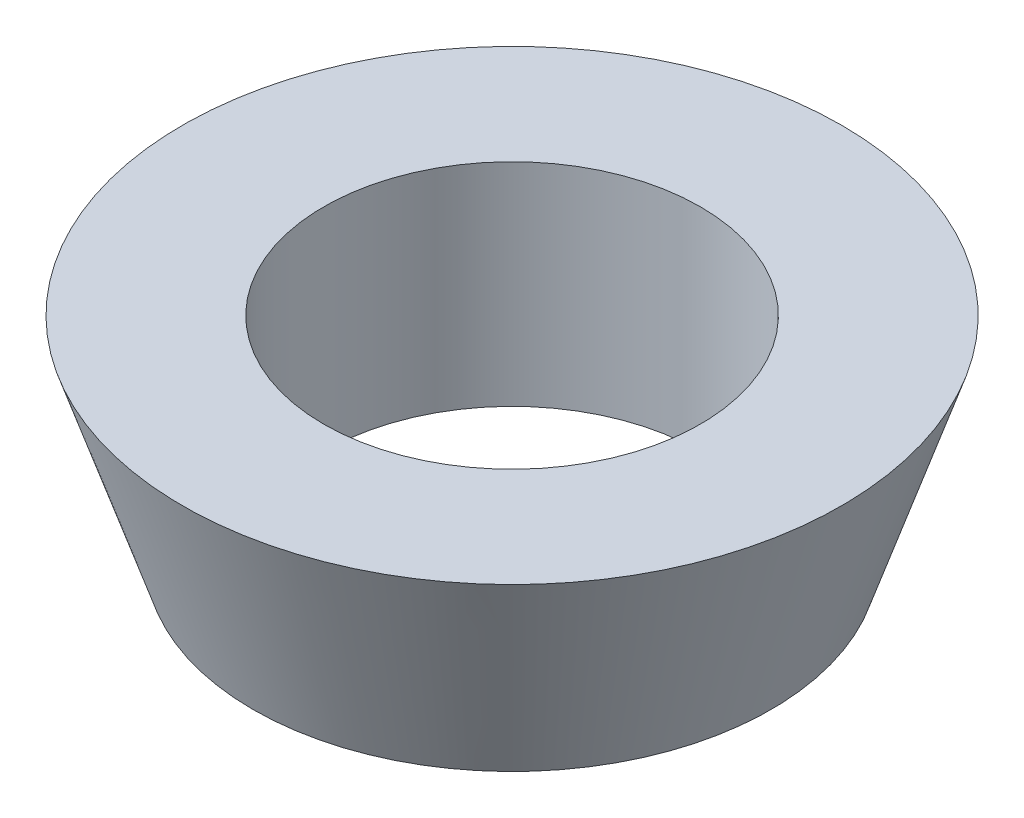
ISO-10303-21;
HEADER;
FILE_DESCRIPTION(('STEP AP214'),'2;1');
FILE_NAME('part.step','',(''),(''),'','','');
FILE_SCHEMA(('AUTOMOTIVE_DESIGN { 1 0 10303 214 1 1 1 1 }'));
ENDSEC;
DATA;
#1=APPLICATION_CONTEXT('core data for automotive mechanical design processes');
#2=APPLICATION_PROTOCOL_DEFINITION('international standard','automotive_design',2000,#1);
#3=PRODUCT_CONTEXT('',#1,'mechanical');
#4=PRODUCT('Part','Part','',(#3));
#5=PRODUCT_RELATED_PRODUCT_CATEGORY('part','',(#4));
#6=PRODUCT_DEFINITION_FORMATION('','',#4);
#7=PRODUCT_DEFINITION_CONTEXT('part definition',#1,'design');
#8=PRODUCT_DEFINITION('design','',#6,#7);
#9=PRODUCT_DEFINITION_SHAPE('','',#8);
#10=(LENGTH_UNIT() NAMED_UNIT(*) SI_UNIT(.MILLI.,.METRE.));
#11=(NAMED_UNIT(*) PLANE_ANGLE_UNIT() SI_UNIT($,.RADIAN.));
#12=(NAMED_UNIT(*) SI_UNIT($,.STERADIAN.) SOLID_ANGLE_UNIT());
#13=UNCERTAINTY_MEASURE_WITH_UNIT(LENGTH_MEASURE(1.E-05),#10,'distance_accuracy_value','');
#14=(GEOMETRIC_REPRESENTATION_CONTEXT(3) GLOBAL_UNCERTAINTY_ASSIGNED_CONTEXT((#13)) GLOBAL_UNIT_ASSIGNED_CONTEXT((#10,
#11,#12)) REPRESENTATION_CONTEXT('',''));
#15=CARTESIAN_POINT('',(0.,0.,0.));
#16=DIRECTION('',(0.,0.,1.));
#17=DIRECTION('',(1.,0.,0.));
#18=AXIS2_PLACEMENT_3D('',#15,#16,#17);
#19=CARTESIAN_POINT('',(0.,0.,0.));
#20=DIRECTION('',(0.,-1.,0.));
#21=DIRECTION('',(0.,0.,-1.));
#22=AXIS2_PLACEMENT_3D('',#19,#20,#21);
#23=CYLINDRICAL_SURFACE('',#22,4.);
#24=CARTESIAN_POINT('',(0.,0.,0.));
#25=DIRECTION('',(0.,-1.,0.));
#26=DIRECTION('',(0.,0.,-1.));
#27=AXIS2_PLACEMENT_3D('',#24,#25,#26);
#28=CIRCLE('',#27,4.);
#29=CARTESIAN_POINT('',(0.,0.,-4.));
#30=VERTEX_POINT('',#29);
#31=EDGE_CURVE('E44',#30,#30,#28,.T.);
#32=ORIENTED_EDGE('',*,*,#31,.T.);
#33=EDGE_LOOP('',(#32));
#34=FACE_BOUND('',#33,.T.);
#35=CARTESIAN_POINT('',(0.,4.5,0.));
#36=DIRECTION('',(0.,-1.,0.));
#37=DIRECTION('',(0.,0.,-1.));
#38=AXIS2_PLACEMENT_3D('',#35,#36,#37);
#39=CIRCLE('',#38,4.);
#40=CARTESIAN_POINT('',(0.,4.5,-4.));
#41=VERTEX_POINT('',#40);
#42=EDGE_CURVE('E10',#41,#41,#39,.T.);
#43=ORIENTED_EDGE('',*,*,#42,.F.);
#44=EDGE_LOOP('',(#43));
#45=FACE_BOUND('',#44,.T.);
#46=ADVANCED_FACE('F30',(#34,#45),#23,.F.);
#47=CARTESIAN_POINT('',(4.,4.5,0.));
#48=DIRECTION('',(0.,1.,0.));
#49=DIRECTION('',(0.,0.,1.));
#50=AXIS2_PLACEMENT_3D('',#47,#48,#49);
#51=PLANE('',#50);
#52=ORIENTED_EDGE('',*,*,#42,.T.);
#53=EDGE_LOOP('',(#52));
#54=FACE_BOUND('',#53,.T.);
#55=CARTESIAN_POINT('',(0.,4.5,0.));
#56=DIRECTION('',(0.,-1.,0.));
#57=DIRECTION('',(0.,0.,-1.));
#58=AXIS2_PLACEMENT_3D('',#55,#56,#57);
#59=CIRCLE('',#58,7.);
#60=CARTESIAN_POINT('',(0.,4.5,-7.));
#61=VERTEX_POINT('',#60);
#62=EDGE_CURVE('E36',#61,#61,#59,.T.);
#63=ORIENTED_EDGE('',*,*,#62,.F.);
#64=EDGE_LOOP('',(#63));
#65=FACE_BOUND('',#64,.T.);
#66=ADVANCED_FACE('F60',(#54,#65),#51,.T.);
#67=CARTESIAN_POINT('',(0.,0.,0.));
#68=DIRECTION('',(0.,1.,0.));
#69=DIRECTION('',(0.,0.,1.));
#70=AXIS2_PLACEMENT_3D('',#67,#68,#69);
#71=CONICAL_SURFACE('',#70,5.5,0.321750554396642);
#72=ORIENTED_EDGE('',*,*,#62,.T.);
#73=EDGE_LOOP('',(#72));
#74=FACE_BOUND('',#73,.T.);
#75=CARTESIAN_POINT('',(0.,0.,0.));
#76=DIRECTION('',(0.,-1.,0.));
#77=DIRECTION('',(0.,0.,-1.));
#78=AXIS2_PLACEMENT_3D('',#75,#76,#77);
#79=CIRCLE('',#78,5.5);
#80=CARTESIAN_POINT('',(0.,0.,-5.5));
#81=VERTEX_POINT('',#80);
#82=EDGE_CURVE('E40',#81,#81,#79,.T.);
#83=ORIENTED_EDGE('',*,*,#82,.F.);
#84=EDGE_LOOP('',(#83));
#85=FACE_BOUND('',#84,.T.);
#86=ADVANCED_FACE('F54',(#74,#85),#71,.T.);
#87=CARTESIAN_POINT('',(5.5,0.,0.));
#88=DIRECTION('',(0.,-1.,0.));
#89=DIRECTION('',(0.,0.,-1.));
#90=AXIS2_PLACEMENT_3D('',#87,#88,#89);
#91=PLANE('',#90);
#92=ORIENTED_EDGE('',*,*,#82,.T.);
#93=EDGE_LOOP('',(#92));
#94=FACE_BOUND('',#93,.T.);
#95=ORIENTED_EDGE('',*,*,#31,.F.);
#96=EDGE_LOOP('',(#95));
#97=FACE_BOUND('',#96,.T.);
#98=ADVANCED_FACE('F52',(#94,#97),#91,.T.);
#99=CLOSED_SHELL('',(#46,#66,#86,#98));
#100=MANIFOLD_SOLID_BREP('B2',#99);
#101=ADVANCED_BREP_SHAPE_REPRESENTATION('',(#18,#100),#14);
#102=SHAPE_DEFINITION_REPRESENTATION(#9,#101);
ENDSEC;
END-ISO-10303-21;
